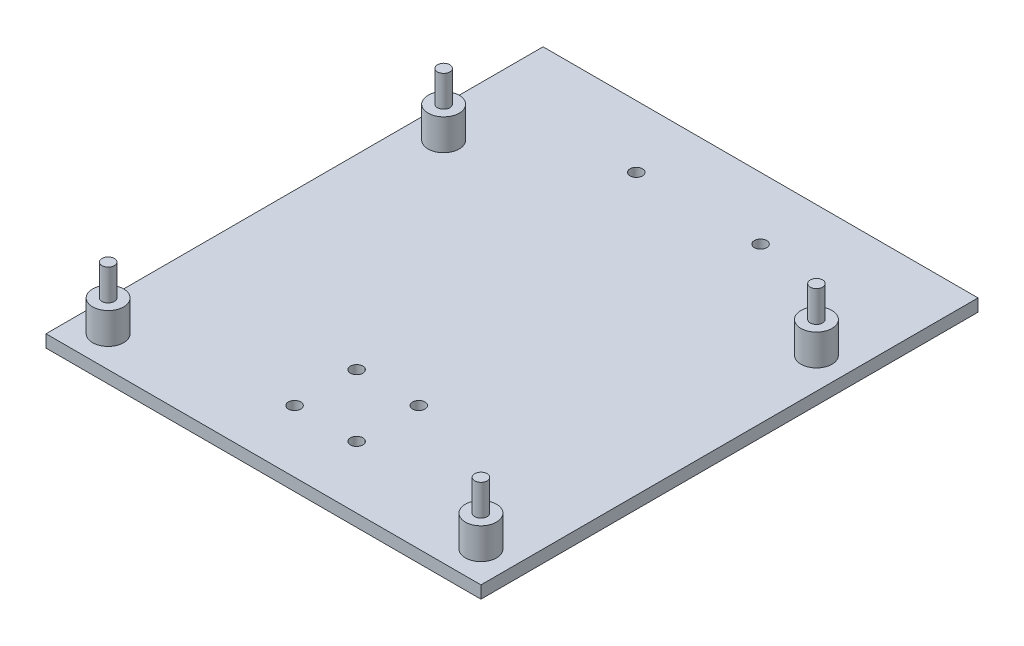
ISO-10303-21;
HEADER;
FILE_DESCRIPTION(('STEP AP214'),'2;1');
FILE_NAME('part.step','',(''),(''),'','','');
FILE_SCHEMA(('AUTOMOTIVE_DESIGN { 1 0 10303 214 1 1 1 1 }'));
ENDSEC;
DATA;
#1=APPLICATION_CONTEXT('core data for automotive mechanical design processes');
#2=APPLICATION_PROTOCOL_DEFINITION('international standard','automotive_design',2000,#1);
#3=PRODUCT_CONTEXT('',#1,'mechanical');
#4=PRODUCT('Part','Part','',(#3));
#5=PRODUCT_RELATED_PRODUCT_CATEGORY('part','',(#4));
#6=PRODUCT_DEFINITION_FORMATION('','',#4);
#7=PRODUCT_DEFINITION_CONTEXT('part definition',#1,'design');
#8=PRODUCT_DEFINITION('design','',#6,#7);
#9=PRODUCT_DEFINITION_SHAPE('','',#8);
#10=(LENGTH_UNIT() NAMED_UNIT(*) SI_UNIT(.MILLI.,.METRE.));
#11=(NAMED_UNIT(*) PLANE_ANGLE_UNIT() SI_UNIT($,.RADIAN.));
#12=(NAMED_UNIT(*) SI_UNIT($,.STERADIAN.) SOLID_ANGLE_UNIT());
#13=UNCERTAINTY_MEASURE_WITH_UNIT(LENGTH_MEASURE(1.E-05),#10,'distance_accuracy_value','');
#14=(GEOMETRIC_REPRESENTATION_CONTEXT(3) GLOBAL_UNCERTAINTY_ASSIGNED_CONTEXT((#13)) GLOBAL_UNIT_ASSIGNED_CONTEXT((#10,
#11,#12)) REPRESENTATION_CONTEXT('',''));
#15=CARTESIAN_POINT('',(0.,0.,0.));
#16=DIRECTION('',(0.,0.,1.));
#17=DIRECTION('',(1.,0.,0.));
#18=AXIS2_PLACEMENT_3D('',#15,#16,#17);
#19=CARTESIAN_POINT('',(-35.,2.,-40.));
#20=DIRECTION('',(1.,0.,0.));
#21=DIRECTION('',(0.,0.,-1.));
#22=AXIS2_PLACEMENT_3D('',#19,#20,#21);
#23=PLANE('',#22);
#24=DIRECTION('',(0.,0.,1.));
#25=VECTOR('',#24,1.);
#26=CARTESIAN_POINT('',(-35.,0.,-40.));
#27=LINE('',#26,#25);
#28=CARTESIAN_POINT('',(-35.,0.,-40.));
#29=VERTEX_POINT('',#28);
#30=CARTESIAN_POINT('',(-35.,0.,40.));
#31=VERTEX_POINT('',#30);
#32=EDGE_CURVE('E106',#29,#31,#27,.T.);
#33=ORIENTED_EDGE('',*,*,#32,.T.);
#34=DIRECTION('',(0.,-1.,0.));
#35=VECTOR('',#34,1.);
#36=CARTESIAN_POINT('',(-35.,2.,40.));
#37=LINE('',#36,#35);
#38=CARTESIAN_POINT('',(-35.,2.,40.));
#39=VERTEX_POINT('',#38);
#40=EDGE_CURVE('E42',#39,#31,#37,.T.);
#41=ORIENTED_EDGE('',*,*,#40,.F.);
#42=DIRECTION('',(0.,0.,1.));
#43=VECTOR('',#42,1.);
#44=CARTESIAN_POINT('',(-35.,2.,-40.));
#45=LINE('',#44,#43);
#46=CARTESIAN_POINT('',(-35.,2.,-40.));
#47=VERTEX_POINT('',#46);
#48=EDGE_CURVE('E91',#47,#39,#45,.T.);
#49=ORIENTED_EDGE('',*,*,#48,.F.);
#50=DIRECTION('',(0.,-1.,0.));
#51=VECTOR('',#50,1.);
#52=CARTESIAN_POINT('',(-35.,2.,-40.));
#53=LINE('',#52,#51);
#54=EDGE_CURVE('E57',#47,#29,#53,.T.);
#55=ORIENTED_EDGE('',*,*,#54,.T.);
#56=EDGE_LOOP('',(#33,#41,#49,#55));
#57=FACE_BOUND('',#56,.T.);
#58=ADVANCED_FACE('F39',(#57),#23,.F.);
#59=CARTESIAN_POINT('',(-35.,2.,40.));
#60=DIRECTION('',(0.,0.,-1.));
#61=DIRECTION('',(-1.,0.,0.));
#62=AXIS2_PLACEMENT_3D('',#59,#60,#61);
#63=PLANE('',#62);
#64=DIRECTION('',(1.,0.,0.));
#65=VECTOR('',#64,1.);
#66=CARTESIAN_POINT('',(-35.,0.,40.));
#67=LINE('',#66,#65);
#68=CARTESIAN_POINT('',(35.,0.,40.));
#69=VERTEX_POINT('',#68);
#70=EDGE_CURVE('E97',#31,#69,#67,.T.);
#71=ORIENTED_EDGE('',*,*,#70,.T.);
#72=DIRECTION('',(0.,-1.,0.));
#73=VECTOR('',#72,1.);
#74=CARTESIAN_POINT('',(35.,2.,40.));
#75=LINE('',#74,#73);
#76=CARTESIAN_POINT('',(35.,2.,40.));
#77=VERTEX_POINT('',#76);
#78=EDGE_CURVE('E95',#77,#69,#75,.T.);
#79=ORIENTED_EDGE('',*,*,#78,.F.);
#80=DIRECTION('',(1.,0.,0.));
#81=VECTOR('',#80,1.);
#82=CARTESIAN_POINT('',(-35.,2.,40.));
#83=LINE('',#82,#81);
#84=EDGE_CURVE('E83',#39,#77,#83,.T.);
#85=ORIENTED_EDGE('',*,*,#84,.F.);
#86=ORIENTED_EDGE('',*,*,#40,.T.);
#87=EDGE_LOOP('',(#71,#79,#85,#86));
#88=FACE_BOUND('',#87,.T.);
#89=ADVANCED_FACE('F96',(#88),#63,.F.);
#90=CARTESIAN_POINT('',(35.,2.,-40.));
#91=DIRECTION('',(1.,0.,0.));
#92=DIRECTION('',(0.,0.,-1.));
#93=AXIS2_PLACEMENT_3D('',#90,#91,#92);
#94=PLANE('',#93);
#95=DIRECTION('',(0.,0.,1.));
#96=VECTOR('',#95,1.);
#97=CARTESIAN_POINT('',(35.,0.,-40.));
#98=LINE('',#97,#96);
#99=CARTESIAN_POINT('',(35.,0.,-40.));
#100=VERTEX_POINT('',#99);
#101=EDGE_CURVE('E110',#100,#69,#98,.T.);
#102=ORIENTED_EDGE('',*,*,#101,.F.);
#103=DIRECTION('',(0.,-1.,0.));
#104=VECTOR('',#103,1.);
#105=CARTESIAN_POINT('',(35.,2.,-40.));
#106=LINE('',#105,#104);
#107=CARTESIAN_POINT('',(35.,2.,-40.));
#108=VERTEX_POINT('',#107);
#109=EDGE_CURVE('E71',#108,#100,#106,.T.);
#110=ORIENTED_EDGE('',*,*,#109,.F.);
#111=DIRECTION('',(0.,0.,1.));
#112=VECTOR('',#111,1.);
#113=CARTESIAN_POINT('',(35.,2.,-40.));
#114=LINE('',#113,#112);
#115=EDGE_CURVE('E90',#108,#77,#114,.T.);
#116=ORIENTED_EDGE('',*,*,#115,.T.);
#117=ORIENTED_EDGE('',*,*,#78,.T.);
#118=EDGE_LOOP('',(#102,#110,#116,#117));
#119=FACE_BOUND('',#118,.T.);
#120=ADVANCED_FACE('F100',(#119),#94,.T.);
#121=CARTESIAN_POINT('',(-35.,2.,-40.));
#122=DIRECTION('',(0.,0.,-1.));
#123=DIRECTION('',(-1.,0.,0.));
#124=AXIS2_PLACEMENT_3D('',#121,#122,#123);
#125=PLANE('',#124);
#126=DIRECTION('',(1.,0.,0.));
#127=VECTOR('',#126,1.);
#128=CARTESIAN_POINT('',(-35.,0.,-40.));
#129=LINE('',#128,#127);
#130=EDGE_CURVE('E112',#29,#100,#129,.T.);
#131=ORIENTED_EDGE('',*,*,#130,.F.);
#132=ORIENTED_EDGE('',*,*,#54,.F.);
#133=DIRECTION('',(1.,0.,0.));
#134=VECTOR('',#133,1.);
#135=CARTESIAN_POINT('',(-35.,2.,-40.));
#136=LINE('',#135,#134);
#137=EDGE_CURVE('E101',#47,#108,#136,.T.);
#138=ORIENTED_EDGE('',*,*,#137,.T.);
#139=ORIENTED_EDGE('',*,*,#109,.T.);
#140=EDGE_LOOP('',(#131,#132,#138,#139));
#141=FACE_BOUND('',#140,.T.);
#142=ADVANCED_FACE('F210',(#141),#125,.T.);
#143=CARTESIAN_POINT('',(0.,2.,0.));
#144=DIRECTION('',(0.,1.,0.));
#145=DIRECTION('',(0.,0.,1.));
#146=AXIS2_PLACEMENT_3D('',#143,#144,#145);
#147=PLANE('',#146);
#148=CARTESIAN_POINT('',(-10.,2.,-30.));
#149=DIRECTION('',(0.,1.,0.));
#150=DIRECTION('',(0.,0.,1.));
#151=AXIS2_PLACEMENT_3D('',#148,#149,#150);
#152=CIRCLE('',#151,1.);
#153=CARTESIAN_POINT('',(-10.,2.,-29.));
#154=VERTEX_POINT('',#153);
#155=EDGE_CURVE('E192',#154,#154,#152,.T.);
#156=ORIENTED_EDGE('',*,*,#155,.F.);
#157=EDGE_LOOP('',(#156));
#158=FACE_BOUND('',#157,.T.);
#159=CARTESIAN_POINT('',(10.,2.,-30.));
#160=DIRECTION('',(0.,1.,0.));
#161=DIRECTION('',(0.,0.,1.));
#162=AXIS2_PLACEMENT_3D('',#159,#160,#161);
#163=CIRCLE('',#162,1.);
#164=CARTESIAN_POINT('',(10.,2.,-29.));
#165=VERTEX_POINT('',#164);
#166=EDGE_CURVE('E189',#165,#165,#163,.T.);
#167=ORIENTED_EDGE('',*,*,#166,.F.);
#168=EDGE_LOOP('',(#167));
#169=FACE_BOUND('',#168,.T.);
#170=CARTESIAN_POINT('',(4.99999999999999,2.,20.));
#171=DIRECTION('',(0.,1.,0.));
#172=DIRECTION('',(0.,0.,1.));
#173=AXIS2_PLACEMENT_3D('',#170,#171,#172);
#174=CIRCLE('',#173,1.);
#175=CARTESIAN_POINT('',(4.99999999999999,2.,21.));
#176=VERTEX_POINT('',#175);
#177=EDGE_CURVE('E165',#176,#176,#174,.T.);
#178=ORIENTED_EDGE('',*,*,#177,.F.);
#179=EDGE_LOOP('',(#178));
#180=FACE_BOUND('',#179,.T.);
#181=CARTESIAN_POINT('',(-4.99999999999997,2.,30.));
#182=DIRECTION('',(0.,1.,0.));
#183=DIRECTION('',(0.,0.,1.));
#184=AXIS2_PLACEMENT_3D('',#181,#182,#183);
#185=CIRCLE('',#184,1.);
#186=CARTESIAN_POINT('',(-4.99999999999997,2.,31.));
#187=VERTEX_POINT('',#186);
#188=EDGE_CURVE('E171',#187,#187,#185,.T.);
#189=ORIENTED_EDGE('',*,*,#188,.F.);
#190=EDGE_LOOP('',(#189));
#191=FACE_BOUND('',#190,.T.);
#192=CARTESIAN_POINT('',(5.,2.,30.));
#193=DIRECTION('',(0.,1.,0.));
#194=DIRECTION('',(0.,0.,1.));
#195=AXIS2_PLACEMENT_3D('',#192,#193,#194);
#196=CIRCLE('',#195,1.);
#197=CARTESIAN_POINT('',(5.,2.,31.));
#198=VERTEX_POINT('',#197);
#199=EDGE_CURVE('E172',#198,#198,#196,.T.);
#200=ORIENTED_EDGE('',*,*,#199,.F.);
#201=EDGE_LOOP('',(#200));
#202=FACE_BOUND('',#201,.T.);
#203=CARTESIAN_POINT('',(-4.99999999999998,2.,20.));
#204=DIRECTION('',(0.,1.,0.));
#205=DIRECTION('',(0.,0.,1.));
#206=AXIS2_PLACEMENT_3D('',#203,#204,#205);
#207=CIRCLE('',#206,1.);
#208=CARTESIAN_POINT('',(-4.99999999999998,2.,21.));
#209=VERTEX_POINT('',#208);
#210=EDGE_CURVE('E162',#209,#209,#207,.T.);
#211=ORIENTED_EDGE('',*,*,#210,.F.);
#212=EDGE_LOOP('',(#211));
#213=FACE_BOUND('',#212,.T.);
#214=CARTESIAN_POINT('',(30.,2.,35.));
#215=DIRECTION('',(0.,1.,0.));
#216=DIRECTION('',(0.,0.,1.));
#217=AXIS2_PLACEMENT_3D('',#214,#215,#216);
#218=CIRCLE('',#217,2.50000000000001);
#219=CARTESIAN_POINT('',(30.,2.,37.5));
#220=VERTEX_POINT('',#219);
#221=EDGE_CURVE('E133',#220,#220,#218,.T.);
#222=ORIENTED_EDGE('',*,*,#221,.F.);
#223=EDGE_LOOP('',(#222));
#224=FACE_BOUND('',#223,.T.);
#225=CARTESIAN_POINT('',(-30.,2.,35.));
#226=DIRECTION('',(0.,1.,0.));
#227=DIRECTION('',(0.,0.,1.));
#228=AXIS2_PLACEMENT_3D('',#225,#226,#227);
#229=CIRCLE('',#228,2.5);
#230=CARTESIAN_POINT('',(-30.,2.,37.5));
#231=VERTEX_POINT('',#230);
#232=EDGE_CURVE('E127',#231,#231,#229,.T.);
#233=ORIENTED_EDGE('',*,*,#232,.F.);
#234=EDGE_LOOP('',(#233));
#235=FACE_BOUND('',#234,.T.);
#236=CARTESIAN_POINT('',(30.,2.,-19.));
#237=DIRECTION('',(0.,1.,0.));
#238=DIRECTION('',(0.,0.,1.));
#239=AXIS2_PLACEMENT_3D('',#236,#237,#238);
#240=CIRCLE('',#239,2.50000000000001);
#241=CARTESIAN_POINT('',(30.,2.,-16.5));
#242=VERTEX_POINT('',#241);
#243=EDGE_CURVE('E121',#242,#242,#240,.T.);
#244=ORIENTED_EDGE('',*,*,#243,.F.);
#245=EDGE_LOOP('',(#244));
#246=FACE_BOUND('',#245,.T.);
#247=CARTESIAN_POINT('',(-30.,2.,-19.));
#248=DIRECTION('',(0.,1.,0.));
#249=DIRECTION('',(0.,0.,1.));
#250=AXIS2_PLACEMENT_3D('',#247,#248,#249);
#251=CIRCLE('',#250,2.5);
#252=CARTESIAN_POINT('',(-30.,2.,-16.5));
#253=VERTEX_POINT('',#252);
#254=EDGE_CURVE('E118',#253,#253,#251,.T.);
#255=ORIENTED_EDGE('',*,*,#254,.F.);
#256=EDGE_LOOP('',(#255));
#257=FACE_BOUND('',#256,.T.);
#258=ORIENTED_EDGE('',*,*,#48,.T.);
#259=ORIENTED_EDGE('',*,*,#84,.T.);
#260=ORIENTED_EDGE('',*,*,#115,.F.);
#261=ORIENTED_EDGE('',*,*,#137,.F.);
#262=EDGE_LOOP('',(#258,#259,#260,#261));
#263=FACE_BOUND('',#262,.T.);
#264=ADVANCED_FACE('F87',(#158,#169,#180,#191,#202,#213,#224,#235,#246,#257,#263),#147,.T.);
#265=CARTESIAN_POINT('',(0.,0.,0.));
#266=DIRECTION('',(0.,1.,0.));
#267=DIRECTION('',(0.,0.,1.));
#268=AXIS2_PLACEMENT_3D('',#265,#266,#267);
#269=PLANE('',#268);
#270=CARTESIAN_POINT('',(-10.,0.,-30.));
#271=DIRECTION('',(0.,1.,0.));
#272=DIRECTION('',(0.,0.,1.));
#273=AXIS2_PLACEMENT_3D('',#270,#271,#272);
#274=CIRCLE('',#273,1.);
#275=CARTESIAN_POINT('',(-10.,0.,-29.));
#276=VERTEX_POINT('',#275);
#277=EDGE_CURVE('E183',#276,#276,#274,.T.);
#278=ORIENTED_EDGE('',*,*,#277,.T.);
#279=EDGE_LOOP('',(#278));
#280=FACE_BOUND('',#279,.T.);
#281=CARTESIAN_POINT('',(10.,0.,-30.));
#282=DIRECTION('',(0.,1.,0.));
#283=DIRECTION('',(0.,0.,1.));
#284=AXIS2_PLACEMENT_3D('',#281,#282,#283);
#285=CIRCLE('',#284,1.);
#286=CARTESIAN_POINT('',(10.,0.,-29.));
#287=VERTEX_POINT('',#286);
#288=EDGE_CURVE('E186',#287,#287,#285,.T.);
#289=ORIENTED_EDGE('',*,*,#288,.T.);
#290=EDGE_LOOP('',(#289));
#291=FACE_BOUND('',#290,.T.);
#292=CARTESIAN_POINT('',(4.99999999999999,0.,20.));
#293=DIRECTION('',(0.,1.,0.));
#294=DIRECTION('',(0.,0.,1.));
#295=AXIS2_PLACEMENT_3D('',#292,#293,#294);
#296=CIRCLE('',#295,1.);
#297=CARTESIAN_POINT('',(4.99999999999999,0.,21.));
#298=VERTEX_POINT('',#297);
#299=EDGE_CURVE('E175',#298,#298,#296,.T.);
#300=ORIENTED_EDGE('',*,*,#299,.T.);
#301=EDGE_LOOP('',(#300));
#302=FACE_BOUND('',#301,.T.);
#303=CARTESIAN_POINT('',(-4.99999999999997,0.,30.));
#304=DIRECTION('',(0.,1.,0.));
#305=DIRECTION('',(0.,0.,1.));
#306=AXIS2_PLACEMENT_3D('',#303,#304,#305);
#307=CIRCLE('',#306,1.);
#308=CARTESIAN_POINT('',(-4.99999999999997,0.,31.));
#309=VERTEX_POINT('',#308);
#310=EDGE_CURVE('E168',#309,#309,#307,.T.);
#311=ORIENTED_EDGE('',*,*,#310,.T.);
#312=EDGE_LOOP('',(#311));
#313=FACE_BOUND('',#312,.T.);
#314=CARTESIAN_POINT('',(5.,0.,30.));
#315=DIRECTION('',(0.,1.,0.));
#316=DIRECTION('',(0.,0.,1.));
#317=AXIS2_PLACEMENT_3D('',#314,#315,#316);
#318=CIRCLE('',#317,1.);
#319=CARTESIAN_POINT('',(5.,0.,31.));
#320=VERTEX_POINT('',#319);
#321=EDGE_CURVE('E180',#320,#320,#318,.T.);
#322=ORIENTED_EDGE('',*,*,#321,.T.);
#323=EDGE_LOOP('',(#322));
#324=FACE_BOUND('',#323,.T.);
#325=CARTESIAN_POINT('',(-4.99999999999998,0.,20.));
#326=DIRECTION('',(0.,1.,0.));
#327=DIRECTION('',(0.,0.,1.));
#328=AXIS2_PLACEMENT_3D('',#325,#326,#327);
#329=CIRCLE('',#328,1.);
#330=CARTESIAN_POINT('',(-4.99999999999998,0.,21.));
#331=VERTEX_POINT('',#330);
#332=EDGE_CURVE('E160',#331,#331,#329,.T.);
#333=ORIENTED_EDGE('',*,*,#332,.T.);
#334=EDGE_LOOP('',(#333));
#335=FACE_BOUND('',#334,.T.);
#336=ORIENTED_EDGE('',*,*,#32,.F.);
#337=ORIENTED_EDGE('',*,*,#130,.T.);
#338=ORIENTED_EDGE('',*,*,#101,.T.);
#339=ORIENTED_EDGE('',*,*,#70,.F.);
#340=EDGE_LOOP('',(#336,#337,#338,#339));
#341=FACE_BOUND('',#340,.T.);
#342=ADVANCED_FACE('F198',(#280,#291,#302,#313,#324,#335,#341),#269,.F.);
#343=CARTESIAN_POINT('',(-30.,7.,-19.));
#344=DIRECTION('',(0.,-1.,0.));
#345=DIRECTION('',(0.,0.,-1.));
#346=AXIS2_PLACEMENT_3D('',#343,#344,#345);
#347=CYLINDRICAL_SURFACE('',#346,2.5);
#348=CARTESIAN_POINT('',(-30.,7.,-19.));
#349=DIRECTION('',(0.,1.,0.));
#350=DIRECTION('',(0.,0.,1.));
#351=AXIS2_PLACEMENT_3D('',#348,#349,#350);
#352=CIRCLE('',#351,2.5);
#353=CARTESIAN_POINT('',(-30.,7.,-16.5));
#354=VERTEX_POINT('',#353);
#355=EDGE_CURVE('E108',#354,#354,#352,.T.);
#356=ORIENTED_EDGE('',*,*,#355,.F.);
#357=EDGE_LOOP('',(#356));
#358=FACE_BOUND('',#357,.T.);
#359=ORIENTED_EDGE('',*,*,#254,.T.);
#360=EDGE_LOOP('',(#359));
#361=FACE_BOUND('',#360,.T.);
#362=ADVANCED_FACE('F230',(#358,#361),#347,.T.);
#363=CARTESIAN_POINT('',(-30.,7.,-19.));
#364=DIRECTION('',(0.,1.,0.));
#365=DIRECTION('',(0.,0.,1.));
#366=AXIS2_PLACEMENT_3D('',#363,#364,#365);
#367=PLANE('',#366);
#368=CARTESIAN_POINT('',(-30.,7.,-19.));
#369=DIRECTION('',(0.,1.,0.));
#370=DIRECTION('',(0.,0.,1.));
#371=AXIS2_PLACEMENT_3D('',#368,#369,#370);
#372=CIRCLE('',#371,1.);
#373=CARTESIAN_POINT('',(-30.,7.,-18.));
#374=VERTEX_POINT('',#373);
#375=EDGE_CURVE('E142',#374,#374,#372,.T.);
#376=ORIENTED_EDGE('',*,*,#375,.F.);
#377=EDGE_LOOP('',(#376));
#378=FACE_BOUND('',#377,.T.);
#379=ORIENTED_EDGE('',*,*,#355,.T.);
#380=EDGE_LOOP('',(#379));
#381=FACE_BOUND('',#380,.T.);
#382=ADVANCED_FACE('F232',(#378,#381),#367,.T.);
#383=CARTESIAN_POINT('',(30.,7.,-19.));
#384=DIRECTION('',(0.,-1.,0.));
#385=DIRECTION('',(0.,0.,-1.));
#386=AXIS2_PLACEMENT_3D('',#383,#384,#385);
#387=CYLINDRICAL_SURFACE('',#386,2.50000000000001);
#388=CARTESIAN_POINT('',(30.,7.,-19.));
#389=DIRECTION('',(0.,1.,0.));
#390=DIRECTION('',(0.,0.,1.));
#391=AXIS2_PLACEMENT_3D('',#388,#389,#390);
#392=CIRCLE('',#391,2.50000000000001);
#393=CARTESIAN_POINT('',(30.,7.,-16.5));
#394=VERTEX_POINT('',#393);
#395=EDGE_CURVE('E124',#394,#394,#392,.T.);
#396=ORIENTED_EDGE('',*,*,#395,.F.);
#397=EDGE_LOOP('',(#396));
#398=FACE_BOUND('',#397,.T.);
#399=ORIENTED_EDGE('',*,*,#243,.T.);
#400=EDGE_LOOP('',(#399));
#401=FACE_BOUND('',#400,.T.);
#402=ADVANCED_FACE('F239',(#398,#401),#387,.T.);
#403=CARTESIAN_POINT('',(30.,7.,-19.));
#404=DIRECTION('',(0.,1.,0.));
#405=DIRECTION('',(0.,0.,1.));
#406=AXIS2_PLACEMENT_3D('',#403,#404,#405);
#407=PLANE('',#406);
#408=CARTESIAN_POINT('',(30.,7.,-19.));
#409=DIRECTION('',(0.,1.,0.));
#410=DIRECTION('',(0.,0.,1.));
#411=AXIS2_PLACEMENT_3D('',#408,#409,#410);
#412=CIRCLE('',#411,1.);
#413=CARTESIAN_POINT('',(30.,7.,-18.));
#414=VERTEX_POINT('',#413);
#415=EDGE_CURVE('E145',#414,#414,#412,.T.);
#416=ORIENTED_EDGE('',*,*,#415,.F.);
#417=EDGE_LOOP('',(#416));
#418=FACE_BOUND('',#417,.T.);
#419=ORIENTED_EDGE('',*,*,#395,.T.);
#420=EDGE_LOOP('',(#419));
#421=FACE_BOUND('',#420,.T.);
#422=ADVANCED_FACE('F309',(#418,#421),#407,.T.);
#423=CARTESIAN_POINT('',(-30.,7.,35.));
#424=DIRECTION('',(0.,-1.,0.));
#425=DIRECTION('',(0.,0.,-1.));
#426=AXIS2_PLACEMENT_3D('',#423,#424,#425);
#427=CYLINDRICAL_SURFACE('',#426,2.5);
#428=CARTESIAN_POINT('',(-30.,7.,35.));
#429=DIRECTION('',(0.,1.,0.));
#430=DIRECTION('',(0.,0.,1.));
#431=AXIS2_PLACEMENT_3D('',#428,#429,#430);
#432=CIRCLE('',#431,2.5);
#433=CARTESIAN_POINT('',(-30.,7.,37.5));
#434=VERTEX_POINT('',#433);
#435=EDGE_CURVE('E130',#434,#434,#432,.T.);
#436=ORIENTED_EDGE('',*,*,#435,.F.);
#437=EDGE_LOOP('',(#436));
#438=FACE_BOUND('',#437,.T.);
#439=ORIENTED_EDGE('',*,*,#232,.T.);
#440=EDGE_LOOP('',(#439));
#441=FACE_BOUND('',#440,.T.);
#442=ADVANCED_FACE('F319',(#438,#441),#427,.T.);
#443=CARTESIAN_POINT('',(-30.,7.,35.));
#444=DIRECTION('',(0.,1.,0.));
#445=DIRECTION('',(0.,0.,1.));
#446=AXIS2_PLACEMENT_3D('',#443,#444,#445);
#447=PLANE('',#446);
#448=CARTESIAN_POINT('',(-30.,7.,35.));
#449=DIRECTION('',(0.,1.,0.));
#450=DIRECTION('',(0.,0.,1.));
#451=AXIS2_PLACEMENT_3D('',#448,#449,#450);
#452=CIRCLE('',#451,1.);
#453=CARTESIAN_POINT('',(-30.,7.,36.));
#454=VERTEX_POINT('',#453);
#455=EDGE_CURVE('E11',#454,#454,#452,.T.);
#456=ORIENTED_EDGE('',*,*,#455,.F.);
#457=EDGE_LOOP('',(#456));
#458=FACE_BOUND('',#457,.T.);
#459=ORIENTED_EDGE('',*,*,#435,.T.);
#460=EDGE_LOOP('',(#459));
#461=FACE_BOUND('',#460,.T.);
#462=ADVANCED_FACE('F329',(#458,#461),#447,.T.);
#463=CARTESIAN_POINT('',(30.,7.,35.));
#464=DIRECTION('',(0.,-1.,0.));
#465=DIRECTION('',(0.,0.,-1.));
#466=AXIS2_PLACEMENT_3D('',#463,#464,#465);
#467=CYLINDRICAL_SURFACE('',#466,2.50000000000001);
#468=CARTESIAN_POINT('',(30.,7.,35.));
#469=DIRECTION('',(0.,1.,0.));
#470=DIRECTION('',(0.,0.,1.));
#471=AXIS2_PLACEMENT_3D('',#468,#469,#470);
#472=CIRCLE('',#471,2.50000000000001);
#473=CARTESIAN_POINT('',(30.,7.,37.5));
#474=VERTEX_POINT('',#473);
#475=EDGE_CURVE('E136',#474,#474,#472,.T.);
#476=ORIENTED_EDGE('',*,*,#475,.F.);
#477=EDGE_LOOP('',(#476));
#478=FACE_BOUND('',#477,.T.);
#479=ORIENTED_EDGE('',*,*,#221,.T.);
#480=EDGE_LOOP('',(#479));
#481=FACE_BOUND('',#480,.T.);
#482=ADVANCED_FACE('F339',(#478,#481),#467,.T.);
#483=CARTESIAN_POINT('',(30.,7.,35.));
#484=DIRECTION('',(0.,1.,0.));
#485=DIRECTION('',(0.,0.,1.));
#486=AXIS2_PLACEMENT_3D('',#483,#484,#485);
#487=PLANE('',#486);
#488=CARTESIAN_POINT('',(30.,7.,35.));
#489=DIRECTION('',(0.,1.,0.));
#490=DIRECTION('',(0.,0.,1.));
#491=AXIS2_PLACEMENT_3D('',#488,#489,#490);
#492=CIRCLE('',#491,1.);
#493=CARTESIAN_POINT('',(30.,7.,36.));
#494=VERTEX_POINT('',#493);
#495=EDGE_CURVE('E48',#494,#494,#492,.T.);
#496=ORIENTED_EDGE('',*,*,#495,.F.);
#497=EDGE_LOOP('',(#496));
#498=FACE_BOUND('',#497,.T.);
#499=ORIENTED_EDGE('',*,*,#475,.T.);
#500=EDGE_LOOP('',(#499));
#501=FACE_BOUND('',#500,.T.);
#502=ADVANCED_FACE('F349',(#498,#501),#487,.T.);
#503=CARTESIAN_POINT('',(-30.,12.,-19.));
#504=DIRECTION('',(0.,-1.,0.));
#505=DIRECTION('',(0.,0.,-1.));
#506=AXIS2_PLACEMENT_3D('',#503,#504,#505);
#507=CYLINDRICAL_SURFACE('',#506,1.);
#508=CARTESIAN_POINT('',(-30.,12.,-19.));
#509=DIRECTION('',(0.,1.,0.));
#510=DIRECTION('',(0.,0.,1.));
#511=AXIS2_PLACEMENT_3D('',#508,#509,#510);
#512=CIRCLE('',#511,1.);
#513=CARTESIAN_POINT('',(-30.,12.,-18.));
#514=VERTEX_POINT('',#513);
#515=EDGE_CURVE('E139',#514,#514,#512,.T.);
#516=ORIENTED_EDGE('',*,*,#515,.F.);
#517=EDGE_LOOP('',(#516));
#518=FACE_BOUND('',#517,.T.);
#519=ORIENTED_EDGE('',*,*,#375,.T.);
#520=EDGE_LOOP('',(#519));
#521=FACE_BOUND('',#520,.T.);
#522=ADVANCED_FACE('F359',(#518,#521),#507,.T.);
#523=CARTESIAN_POINT('',(-30.,12.,-19.));
#524=DIRECTION('',(0.,1.,0.));
#525=DIRECTION('',(0.,0.,1.));
#526=AXIS2_PLACEMENT_3D('',#523,#524,#525);
#527=PLANE('',#526);
#528=ORIENTED_EDGE('',*,*,#515,.T.);
#529=EDGE_LOOP('',(#528));
#530=FACE_BOUND('',#529,.T.);
#531=ADVANCED_FACE('F369',(#530),#527,.T.);
#532=CARTESIAN_POINT('',(30.,12.,-19.));
#533=DIRECTION('',(0.,-1.,0.));
#534=DIRECTION('',(0.,0.,-1.));
#535=AXIS2_PLACEMENT_3D('',#532,#533,#534);
#536=CYLINDRICAL_SURFACE('',#535,1.);
#537=CARTESIAN_POINT('',(30.,12.,-19.));
#538=DIRECTION('',(0.,1.,0.));
#539=DIRECTION('',(0.,0.,1.));
#540=AXIS2_PLACEMENT_3D('',#537,#538,#539);
#541=CIRCLE('',#540,1.);
#542=CARTESIAN_POINT('',(30.,12.,-18.));
#543=VERTEX_POINT('',#542);
#544=EDGE_CURVE('E148',#543,#543,#541,.T.);
#545=ORIENTED_EDGE('',*,*,#544,.F.);
#546=EDGE_LOOP('',(#545));
#547=FACE_BOUND('',#546,.T.);
#548=ORIENTED_EDGE('',*,*,#415,.T.);
#549=EDGE_LOOP('',(#548));
#550=FACE_BOUND('',#549,.T.);
#551=ADVANCED_FACE('F379',(#547,#550),#536,.T.);
#552=CARTESIAN_POINT('',(30.,12.,-19.));
#553=DIRECTION('',(0.,1.,0.));
#554=DIRECTION('',(0.,0.,1.));
#555=AXIS2_PLACEMENT_3D('',#552,#553,#554);
#556=PLANE('',#555);
#557=ORIENTED_EDGE('',*,*,#544,.T.);
#558=EDGE_LOOP('',(#557));
#559=FACE_BOUND('',#558,.T.);
#560=ADVANCED_FACE('F389',(#559),#556,.T.);
#561=CARTESIAN_POINT('',(30.,12.,35.));
#562=DIRECTION('',(0.,-1.,0.));
#563=DIRECTION('',(0.,0.,-1.));
#564=AXIS2_PLACEMENT_3D('',#561,#562,#563);
#565=CYLINDRICAL_SURFACE('',#564,1.);
#566=CARTESIAN_POINT('',(30.,12.,35.));
#567=DIRECTION('',(0.,1.,0.));
#568=DIRECTION('',(0.,0.,1.));
#569=AXIS2_PLACEMENT_3D('',#566,#567,#568);
#570=CIRCLE('',#569,1.);
#571=CARTESIAN_POINT('',(30.,12.,36.));
#572=VERTEX_POINT('',#571);
#573=EDGE_CURVE('E151',#572,#572,#570,.T.);
#574=ORIENTED_EDGE('',*,*,#573,.F.);
#575=EDGE_LOOP('',(#574));
#576=FACE_BOUND('',#575,.T.);
#577=ORIENTED_EDGE('',*,*,#495,.T.);
#578=EDGE_LOOP('',(#577));
#579=FACE_BOUND('',#578,.T.);
#580=ADVANCED_FACE('F399',(#576,#579),#565,.T.);
#581=CARTESIAN_POINT('',(30.,12.,35.));
#582=DIRECTION('',(0.,1.,0.));
#583=DIRECTION('',(0.,0.,1.));
#584=AXIS2_PLACEMENT_3D('',#581,#582,#583);
#585=PLANE('',#584);
#586=ORIENTED_EDGE('',*,*,#573,.T.);
#587=EDGE_LOOP('',(#586));
#588=FACE_BOUND('',#587,.T.);
#589=ADVANCED_FACE('F409',(#588),#585,.T.);
#590=CARTESIAN_POINT('',(-30.,12.,35.));
#591=DIRECTION('',(0.,-1.,0.));
#592=DIRECTION('',(0.,0.,-1.));
#593=AXIS2_PLACEMENT_3D('',#590,#591,#592);
#594=CYLINDRICAL_SURFACE('',#593,1.);
#595=CARTESIAN_POINT('',(-30.,12.,35.));
#596=DIRECTION('',(0.,1.,0.));
#597=DIRECTION('',(0.,0.,1.));
#598=AXIS2_PLACEMENT_3D('',#595,#596,#597);
#599=CIRCLE('',#598,1.);
#600=CARTESIAN_POINT('',(-30.,12.,36.));
#601=VERTEX_POINT('',#600);
#602=EDGE_CURVE('E156',#601,#601,#599,.T.);
#603=ORIENTED_EDGE('',*,*,#602,.F.);
#604=EDGE_LOOP('',(#603));
#605=FACE_BOUND('',#604,.T.);
#606=ORIENTED_EDGE('',*,*,#455,.T.);
#607=EDGE_LOOP('',(#606));
#608=FACE_BOUND('',#607,.T.);
#609=ADVANCED_FACE('F419',(#605,#608),#594,.T.);
#610=CARTESIAN_POINT('',(-30.,12.,35.));
#611=DIRECTION('',(0.,1.,0.));
#612=DIRECTION('',(0.,0.,1.));
#613=AXIS2_PLACEMENT_3D('',#610,#611,#612);
#614=PLANE('',#613);
#615=ORIENTED_EDGE('',*,*,#602,.T.);
#616=EDGE_LOOP('',(#615));
#617=FACE_BOUND('',#616,.T.);
#618=ADVANCED_FACE('F429',(#617),#614,.T.);
#619=CARTESIAN_POINT('',(-4.99999999999998,0.,20.));
#620=DIRECTION('',(0.,1.,0.));
#621=DIRECTION('',(0.,0.,1.));
#622=AXIS2_PLACEMENT_3D('',#619,#620,#621);
#623=CYLINDRICAL_SURFACE('',#622,1.);
#624=ORIENTED_EDGE('',*,*,#332,.F.);
#625=EDGE_LOOP('',(#624));
#626=FACE_BOUND('',#625,.T.);
#627=ORIENTED_EDGE('',*,*,#210,.T.);
#628=EDGE_LOOP('',(#627));
#629=FACE_BOUND('',#628,.T.);
#630=ADVANCED_FACE('F439',(#626,#629),#623,.F.);
#631=CARTESIAN_POINT('',(5.,0.,30.));
#632=DIRECTION('',(0.,1.,0.));
#633=DIRECTION('',(0.,0.,1.));
#634=AXIS2_PLACEMENT_3D('',#631,#632,#633);
#635=CYLINDRICAL_SURFACE('',#634,1.);
#636=ORIENTED_EDGE('',*,*,#321,.F.);
#637=EDGE_LOOP('',(#636));
#638=FACE_BOUND('',#637,.T.);
#639=ORIENTED_EDGE('',*,*,#199,.T.);
#640=EDGE_LOOP('',(#639));
#641=FACE_BOUND('',#640,.T.);
#642=ADVANCED_FACE('F449',(#638,#641),#635,.F.);
#643=CARTESIAN_POINT('',(-4.99999999999997,0.,30.));
#644=DIRECTION('',(0.,1.,0.));
#645=DIRECTION('',(0.,0.,1.));
#646=AXIS2_PLACEMENT_3D('',#643,#644,#645);
#647=CYLINDRICAL_SURFACE('',#646,1.);
#648=ORIENTED_EDGE('',*,*,#310,.F.);
#649=EDGE_LOOP('',(#648));
#650=FACE_BOUND('',#649,.T.);
#651=ORIENTED_EDGE('',*,*,#188,.T.);
#652=EDGE_LOOP('',(#651));
#653=FACE_BOUND('',#652,.T.);
#654=ADVANCED_FACE('F459',(#650,#653),#647,.F.);
#655=CARTESIAN_POINT('',(4.99999999999999,0.,20.));
#656=DIRECTION('',(0.,1.,0.));
#657=DIRECTION('',(0.,0.,1.));
#658=AXIS2_PLACEMENT_3D('',#655,#656,#657);
#659=CYLINDRICAL_SURFACE('',#658,1.);
#660=ORIENTED_EDGE('',*,*,#299,.F.);
#661=EDGE_LOOP('',(#660));
#662=FACE_BOUND('',#661,.T.);
#663=ORIENTED_EDGE('',*,*,#177,.T.);
#664=EDGE_LOOP('',(#663));
#665=FACE_BOUND('',#664,.T.);
#666=ADVANCED_FACE('F469',(#662,#665),#659,.F.);
#667=CARTESIAN_POINT('',(10.,0.,-30.));
#668=DIRECTION('',(0.,1.,0.));
#669=DIRECTION('',(0.,0.,1.));
#670=AXIS2_PLACEMENT_3D('',#667,#668,#669);
#671=CYLINDRICAL_SURFACE('',#670,1.);
#672=ORIENTED_EDGE('',*,*,#288,.F.);
#673=EDGE_LOOP('',(#672));
#674=FACE_BOUND('',#673,.T.);
#675=ORIENTED_EDGE('',*,*,#166,.T.);
#676=EDGE_LOOP('',(#675));
#677=FACE_BOUND('',#676,.T.);
#678=ADVANCED_FACE('F204',(#674,#677),#671,.F.);
#679=CARTESIAN_POINT('',(-10.,0.,-30.));
#680=DIRECTION('',(0.,1.,0.));
#681=DIRECTION('',(0.,0.,1.));
#682=AXIS2_PLACEMENT_3D('',#679,#680,#681);
#683=CYLINDRICAL_SURFACE('',#682,1.);
#684=ORIENTED_EDGE('',*,*,#277,.F.);
#685=EDGE_LOOP('',(#684));
#686=FACE_BOUND('',#685,.T.);
#687=ORIENTED_EDGE('',*,*,#155,.T.);
#688=EDGE_LOOP('',(#687));
#689=FACE_BOUND('',#688,.T.);
#690=ADVANCED_FACE('F201',(#686,#689),#683,.F.);
#691=CLOSED_SHELL('',(#58,#89,#120,#142,#264,#342,#362,#382,#402,#422,#442,#462,#482,#502,#522,
#531,#551,#560,#580,#589,#609,#618,#630,#642,#654,#666,#678,#690));
#692=MANIFOLD_SOLID_BREP('B2',#691);
#693=ADVANCED_BREP_SHAPE_REPRESENTATION('',(#18,#692),#14);
#694=SHAPE_DEFINITION_REPRESENTATION(#9,#693);
ENDSEC;
END-ISO-10303-21;
